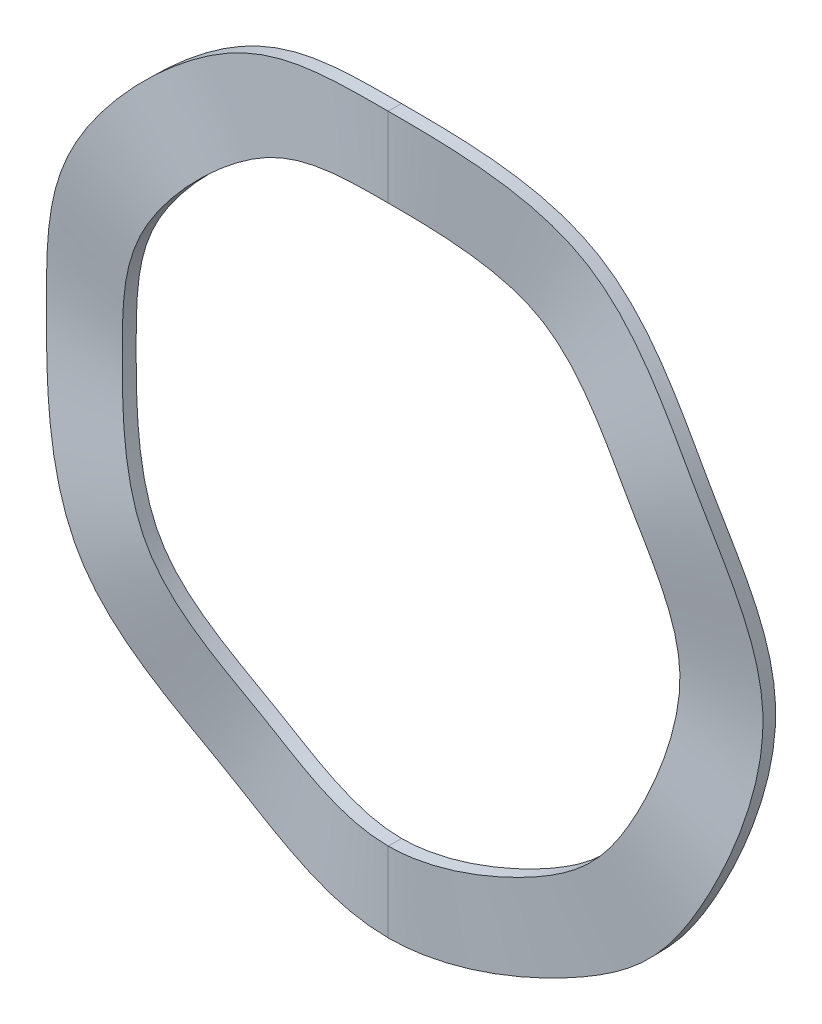
ISO-10303-21;
HEADER;
FILE_DESCRIPTION(('STEP AP214'),'2;1');
FILE_NAME('part.step','',(''),(''),'','','');
FILE_SCHEMA(('AUTOMOTIVE_DESIGN { 1 0 10303 214 1 1 1 1 }'));
ENDSEC;
DATA;
#1=APPLICATION_CONTEXT('core data for automotive mechanical design processes');
#2=APPLICATION_PROTOCOL_DEFINITION('international standard','automotive_design',2000,#1);
#3=PRODUCT_CONTEXT('',#1,'mechanical');
#4=PRODUCT('Part','Part','',(#3));
#5=PRODUCT_RELATED_PRODUCT_CATEGORY('part','',(#4));
#6=PRODUCT_DEFINITION_FORMATION('','',#4);
#7=PRODUCT_DEFINITION_CONTEXT('part definition',#1,'design');
#8=PRODUCT_DEFINITION('design','',#6,#7);
#9=PRODUCT_DEFINITION_SHAPE('','',#8);
#10=(LENGTH_UNIT() NAMED_UNIT(*) SI_UNIT(.MILLI.,.METRE.));
#11=(NAMED_UNIT(*) PLANE_ANGLE_UNIT() SI_UNIT($,.RADIAN.));
#12=(NAMED_UNIT(*) SI_UNIT($,.STERADIAN.) SOLID_ANGLE_UNIT());
#13=UNCERTAINTY_MEASURE_WITH_UNIT(LENGTH_MEASURE(1.E-05),#10,'distance_accuracy_value','');
#14=(GEOMETRIC_REPRESENTATION_CONTEXT(3) GLOBAL_UNCERTAINTY_ASSIGNED_CONTEXT((#13)) GLOBAL_UNIT_ASSIGNED_CONTEXT((#10,
#11,#12)) REPRESENTATION_CONTEXT('',''));
#15=CARTESIAN_POINT('',(0.,0.,0.));
#16=DIRECTION('',(0.,0.,1.));
#17=DIRECTION('',(1.,0.,0.));
#18=AXIS2_PLACEMENT_3D('',#15,#16,#17);
#19=CARTESIAN_POINT('',(0.,10.5,0.350000000000017));
#20=CARTESIAN_POINT('',(1.77728538317066,10.5000000018196,0.349999981886998));
#21=CARTESIAN_POINT('',(3.64871314918132,10.0076863447893,-0.13696586913417));
#22=CARTESIAN_POINT('',(6.84255403803462,8.1637214592486,-0.136966049851306));
#23=CARTESIAN_POINT('',(8.20466639914961,6.78915201465216,0.34974474595062));
#24=CARTESIAN_POINT('',(9.981911333171,3.71087353474015,0.349744529637985));
#25=CARTESIAN_POINT('',(10.4912811917421,1.84401258476812,-0.137222232479112));
#26=CARTESIAN_POINT('',(10.4912811897513,-1.84401258476917,-0.137222196130521));
#27=CARTESIAN_POINT('',(9.98191133160665,-3.71087353383022,0.349744547752384));
#28=CARTESIAN_POINT('',(8.20466640071307,-6.78915201556366,0.349744727836221));
#29=CARTESIAN_POINT('',(6.84255403853381,-8.16372146011046,-0.136966068026295));
#30=CARTESIAN_POINT('',(3.64871314868136,-10.0076863439278,-0.136965850959209));
#31=CARTESIAN_POINT('',(1.77727450652611,-10.5,0.349999999999962));
#32=CARTESIAN_POINT('',(0.,-10.5,0.35));
#33=CARTESIAN_POINT('',(0.,10.5,0.85));
#34=CARTESIAN_POINT('',(1.86545781878836,10.4999999981961,0.84999998188686));
#35=CARTESIAN_POINT('',(3.73278356534547,9.98519360415671,0.362525102079958));
#36=CARTESIAN_POINT('',(6.78103952717459,8.22528217387854,0.362524922987439));
#37=CARTESIAN_POINT('',(8.16054053163023,6.86547815698175,0.849744743344483));
#38=CARTESIAN_POINT('',(10.0259487401757,3.63449631970855,0.849744527027296));
#39=CARTESIAN_POINT('',(10.5137860726038,1.75994957860988,0.362271041086604));
#40=CARTESIAN_POINT('',(10.5137860778482,-1.75994957861096,0.362271077109233));
#41=CARTESIAN_POINT('',(10.0259487417489,-3.63449632060939,0.849744545142112));
#42=CARTESIAN_POINT('',(8.1605405300561,-6.86547815608253,0.84974472522964));
#43=CARTESIAN_POINT('',(6.78103952586401,-8.22528217160678,0.36252490497593));
#44=CARTESIAN_POINT('',(3.73278356665524,-9.98519360642895,0.362525120091439));
#45=CARTESIAN_POINT('',(1.86545990356562,-10.5,0.849999999999962));
#46=CARTESIAN_POINT('',(0.,-10.5,0.85));
#47=(BOUNDED_SURFACE() B_SPLINE_SURFACE(1,3,((#19,#20,#21,#22,#23,#24,#25,#26,#27,#28,#29,#30,
#31,#32),(#33,#34,#35,#36,#37,#38,#39,#40,#41,#42,#43,#44,#45,#46)),.UNSPECIFIED.,.F.,.F.,
.F.) B_SPLINE_SURFACE_WITH_KNOTS((2,2),(4,2,2,2,2,2,4),(0.,1.),(0.499999999999992,
0.583333333333328,0.66666666666667,0.75,0.833333333333335,0.916666666666669,1.),
.UNSPECIFIED.) GEOMETRIC_REPRESENTATION_ITEM() RATIONAL_B_SPLINE_SURFACE(((1.,1.,1.,1.,1.,1.,1.,
1.,1.,1.,1.,1.,1.,1.),(1.,1.,1.,1.,1.,1.,1.,1.,1.,1.,1.,1.,1.,1.))) REPRESENTATION_ITEM('') SURFACE());
#48=CARTESIAN_POINT('',(3.16306254910685E-13,10.5,0.350000000000017));
#49=CARTESIAN_POINT('',(2.702785568837E-13,10.5,0.85));
#50=(BOUNDED_CURVE() B_SPLINE_CURVE(1,(#48,#49),.UNSPECIFIED.,.F.,
.F.) B_SPLINE_CURVE_WITH_KNOTS((2,2),(0.,1.),
.UNSPECIFIED.) CURVE() GEOMETRIC_REPRESENTATION_ITEM() RATIONAL_B_SPLINE_CURVE((1.,1.)) REPRESENTATION_ITEM(''));
#51=CARTESIAN_POINT('',(3.16306254910685E-13,10.5,0.350000000000017));
#52=VERTEX_POINT('',#51);
#53=CARTESIAN_POINT('',(2.702785568837E-13,10.5,0.85));
#54=VERTEX_POINT('',#53);
#55=EDGE_CURVE('E109',#52,#54,#50,.T.);
#56=CARTESIAN_POINT('',(3.16306254910685E-13,10.5,0.350000000000017));
#57=CARTESIAN_POINT('',(1.77728538317091,10.5000000018195,0.349999981886935));
#58=CARTESIAN_POINT('',(3.64871314918137,10.0076863447892,-0.13696586913417));
#59=CARTESIAN_POINT('',(6.84255403803462,8.1637214592486,-0.136966049851306));
#60=CARTESIAN_POINT('',(8.20466639914961,6.78915201465216,0.34974474595062));
#61=CARTESIAN_POINT('',(9.981911333171,3.71087353474015,0.349744529637985));
#62=CARTESIAN_POINT('',(10.4912811917421,1.84401258476812,-0.137222232479112));
#63=CARTESIAN_POINT('',(10.4912811897513,-1.84401258476917,-0.137222196130521));
#64=CARTESIAN_POINT('',(9.98191133160665,-3.71087353383022,0.349744547752384));
#65=CARTESIAN_POINT('',(8.20466640071307,-6.78915201556366,0.349744727836221));
#66=CARTESIAN_POINT('',(6.84255403853381,-8.16372146011046,-0.136966068026295));
#67=CARTESIAN_POINT('',(3.64871314868136,-10.0076863439278,-0.136965850959209));
#68=CARTESIAN_POINT('',(1.77727450652611,-10.5,0.349999999999962));
#69=CARTESIAN_POINT('',(0.,-10.5,0.35));
#70=(BOUNDED_CURVE() B_SPLINE_CURVE(3,(#56,#57,#58,#59,#60,#61,#62,#63,#64,#65,#66,#67,#68,#69),
.UNSPECIFIED.,.F.,.F.) B_SPLINE_CURVE_WITH_KNOTS((4,2,2,2,2,2,4),(0.5,0.583333333333335,
0.666666666666676,0.75,0.833333333333338,0.916666666666671,1.),
.UNSPECIFIED.) CURVE() GEOMETRIC_REPRESENTATION_ITEM() RATIONAL_B_SPLINE_CURVE((1.,1.,1.,1.,1.,
1.,1.,1.,1.,1.,1.,1.,1.,1.)) REPRESENTATION_ITEM(''));
#71=CARTESIAN_POINT('',(0.,-10.5,0.35));
#72=VERTEX_POINT('',#71);
#73=EDGE_CURVE('E11',#52,#72,#70,.T.);
#74=CARTESIAN_POINT('',(0.,-10.5,0.35));
#75=CARTESIAN_POINT('',(0.,-10.5,0.85));
#76=(BOUNDED_CURVE() B_SPLINE_CURVE(1,(#74,#75),.UNSPECIFIED.,.F.,
.F.) B_SPLINE_CURVE_WITH_KNOTS((2,2),(0.,1.),
.UNSPECIFIED.) CURVE() GEOMETRIC_REPRESENTATION_ITEM() RATIONAL_B_SPLINE_CURVE((1.,1.)) REPRESENTATION_ITEM(''));
#77=CARTESIAN_POINT('',(0.,-10.5,0.85));
#78=VERTEX_POINT('',#77);
#79=EDGE_CURVE('E22',#72,#78,#76,.T.);
#80=CARTESIAN_POINT('',(2.702785568837E-13,10.5,0.85));
#81=CARTESIAN_POINT('',(1.86545781878849,10.4999999981961,0.849999981886825));
#82=CARTESIAN_POINT('',(3.73278356534547,9.98519360415671,0.362525102079958));
#83=CARTESIAN_POINT('',(6.78103952717459,8.22528217387854,0.362524922987439));
#84=CARTESIAN_POINT('',(8.16054053163023,6.86547815698175,0.849744743344483));
#85=CARTESIAN_POINT('',(10.0259487401757,3.63449631970855,0.849744527027296));
#86=CARTESIAN_POINT('',(10.5137860726038,1.75994957860988,0.362271041086604));
#87=CARTESIAN_POINT('',(10.5137860778482,-1.75994957861096,0.362271077109233));
#88=CARTESIAN_POINT('',(10.0259487417489,-3.63449632060939,0.849744545142112));
#89=CARTESIAN_POINT('',(8.1605405300561,-6.86547815608253,0.84974472522964));
#90=CARTESIAN_POINT('',(6.78103952586401,-8.22528217160678,0.36252490497593));
#91=CARTESIAN_POINT('',(3.73278356665524,-9.98519360642895,0.362525120091439));
#92=CARTESIAN_POINT('',(1.86545990356562,-10.5,0.849999999999962));
#93=CARTESIAN_POINT('',(0.,-10.5,0.85));
#94=(BOUNDED_CURVE() B_SPLINE_CURVE(3,(#80,#81,#82,#83,#84,#85,#86,#87,#88,#89,#90,#91,#92,#93),
.UNSPECIFIED.,.F.,.F.) B_SPLINE_CURVE_WITH_KNOTS((4,2,2,2,2,2,4),(0.5,0.583333333333333,
0.666666666666674,0.75,0.833333333333338,0.91666666666667,1.),
.UNSPECIFIED.) CURVE() GEOMETRIC_REPRESENTATION_ITEM() RATIONAL_B_SPLINE_CURVE((1.,1.,1.,1.,1.,
1.,1.,1.,1.,1.,1.,1.,1.,1.)) REPRESENTATION_ITEM(''));
#95=EDGE_CURVE('E78',#54,#78,#94,.T.);
#96=ORIENTED_EDGE('',*,*,#55,.F.);
#97=ORIENTED_EDGE('',*,*,#73,.T.);
#98=ORIENTED_EDGE('',*,*,#79,.T.);
#99=ORIENTED_EDGE('',*,*,#95,.F.);
#100=EDGE_LOOP('',(#96,#97,#98,#99));
#101=FACE_BOUND('',#100,.T.);
#102=ADVANCED_FACE('F16',(#101),#47,.F.);
#103=CARTESIAN_POINT('',(0.,13.5,0.350000000000017));
#104=CARTESIAN_POINT('',(2.31317849028773,13.5000000018176,0.350000003621701));
#105=CARTESIAN_POINT('',(4.66289318457483,12.8827241886085,-0.272301408902137));
#106=CARTESIAN_POINT('',(8.82531983479983,10.4795460642598,-0.272301373732492));
#107=CARTESIAN_POINT('',(10.5347690255751,8.75329584755968,0.350051052374429));
#108=CARTESIAN_POINT('',(12.8479611023448,4.74672968618188,0.35005109563796));
#109=CARTESIAN_POINT('',(13.4882408331361,2.40317431503527,-0.272251517642486));
#110=CARTESIAN_POINT('',(13.48824082919,-2.40317431503662,-0.272251524718881));
#111=CARTESIAN_POINT('',(12.8479611007803,-4.74672968527711,0.350051092016329));
#112=CARTESIAN_POINT('',(10.5347690271384,-8.75329584846648,0.350051055996059));
#113=CARTESIAN_POINT('',(8.82531983578968,-10.4795460659696,-0.272301370194933));
#114=CARTESIAN_POINT('',(4.66289318358393,-12.8827241868993,-0.272301412439696));
#115=CARTESIAN_POINT('',(2.31317289138833,-13.5,0.349999999999933));
#116=CARTESIAN_POINT('',(0.,-13.5,0.35));
#117=CARTESIAN_POINT('',(0.,10.5,0.350000000000017));
#118=CARTESIAN_POINT('',(1.7772853831707,10.5000000018196,0.349999981886988));
#119=CARTESIAN_POINT('',(3.64871314918136,10.0076863447892,-0.13696586913417));
#120=CARTESIAN_POINT('',(6.84255403803462,8.1637214592486,-0.136966049851306));
#121=CARTESIAN_POINT('',(8.20466639914961,6.78915201465216,0.34974474595062));
#122=CARTESIAN_POINT('',(9.981911333171,3.71087353474015,0.349744529637985));
#123=CARTESIAN_POINT('',(10.4912811917421,1.84401258476812,-0.137222232479112));
#124=CARTESIAN_POINT('',(10.4912811897513,-1.84401258476917,-0.137222196130521));
#125=CARTESIAN_POINT('',(9.98191133160665,-3.71087353383022,0.349744547752384));
#126=CARTESIAN_POINT('',(8.20466640071307,-6.78915201556366,0.349744727836221));
#127=CARTESIAN_POINT('',(6.84255403853381,-8.16372146011046,-0.136966068026295));
#128=CARTESIAN_POINT('',(3.64871314868136,-10.0076863439278,-0.136965850959209));
#129=CARTESIAN_POINT('',(1.77727450652611,-10.5,0.349999999999962));
#130=CARTESIAN_POINT('',(0.,-10.5,0.35));
#131=(BOUNDED_SURFACE() B_SPLINE_SURFACE(1,3,((#103,#104,#105,#106,#107,#108,#109,#110,#111,
#112,#113,#114,#115,#116),(#117,#118,#119,#120,#121,#122,#123,#124,#125,#126,#127,#128,#129,
#130)),.UNSPECIFIED.,.F.,.F.,.F.) B_SPLINE_SURFACE_WITH_KNOTS((2,2),(4,2,2,2,2,2,4),(0.,1.),
(0.499999999999992,0.583333333333328,0.66666666666667,0.75,0.833333333333335,0.916666666666669,
1.),.UNSPECIFIED.) GEOMETRIC_REPRESENTATION_ITEM() RATIONAL_B_SPLINE_SURFACE(((1.,1.,1.,1.,1.,
1.,1.,1.,1.,1.,1.,1.,1.,1.),(1.,1.,1.,1.,1.,1.,1.,1.,1.,1.,1.,1.,1.,1.))) REPRESENTATION_ITEM('') SURFACE());
#132=CARTESIAN_POINT('',(3.56467411762523E-13,13.5,0.350000000000017));
#133=CARTESIAN_POINT('',(3.16306254910685E-13,10.5,0.350000000000017));
#134=(BOUNDED_CURVE() B_SPLINE_CURVE(1,(#132,#133),.UNSPECIFIED.,.F.,
.F.) B_SPLINE_CURVE_WITH_KNOTS((2,2),(0.,1.),
.UNSPECIFIED.) CURVE() GEOMETRIC_REPRESENTATION_ITEM() RATIONAL_B_SPLINE_CURVE((1.,1.)) REPRESENTATION_ITEM(''));
#135=CARTESIAN_POINT('',(3.56467411762523E-13,13.5,0.350000000000017));
#136=VERTEX_POINT('',#135);
#137=EDGE_CURVE('E94',#136,#52,#134,.T.);
#138=CARTESIAN_POINT('',(3.56467411762523E-13,13.5,0.350000000000017));
#139=CARTESIAN_POINT('',(2.31317849028795,13.5000000018175,0.350000003621642));
#140=CARTESIAN_POINT('',(4.66289318457483,12.8827241886085,-0.272301408902137));
#141=CARTESIAN_POINT('',(8.82531983479983,10.4795460642598,-0.272301373732492));
#142=CARTESIAN_POINT('',(10.5347690255751,8.75329584755968,0.350051052374429));
#143=CARTESIAN_POINT('',(12.8479611023448,4.74672968618188,0.35005109563796));
#144=CARTESIAN_POINT('',(13.4882408331361,2.40317431503527,-0.272251517642486));
#145=CARTESIAN_POINT('',(13.48824082919,-2.40317431503662,-0.272251524718881));
#146=CARTESIAN_POINT('',(12.8479611007803,-4.74672968527711,0.350051092016329));
#147=CARTESIAN_POINT('',(10.5347690271384,-8.75329584846648,0.350051055996059));
#148=CARTESIAN_POINT('',(8.82531983578968,-10.4795460659696,-0.272301370194933));
#149=CARTESIAN_POINT('',(4.66289318358393,-12.8827241868993,-0.272301412439696));
#150=CARTESIAN_POINT('',(2.31317289138833,-13.5,0.349999999999933));
#151=CARTESIAN_POINT('',(0.,-13.5,0.35));
#152=(BOUNDED_CURVE() B_SPLINE_CURVE(3,(#138,#139,#140,#141,#142,#143,#144,#145,#146,#147,#148,
#149,#150,#151),.UNSPECIFIED.,.F.,.F.) B_SPLINE_CURVE_WITH_KNOTS((4,2,2,2,2,2,4),(0.5,
0.583333333333335,0.666666666666676,0.75,0.833333333333338,0.916666666666671,1.),
.UNSPECIFIED.) CURVE() GEOMETRIC_REPRESENTATION_ITEM() RATIONAL_B_SPLINE_CURVE((1.,1.,1.,1.,1.,
1.,1.,1.,1.,1.,1.,1.,1.,1.)) REPRESENTATION_ITEM(''));
#153=CARTESIAN_POINT('',(0.,-13.5,0.35));
#154=VERTEX_POINT('',#153);
#155=EDGE_CURVE('E31',#136,#154,#152,.T.);
#156=CARTESIAN_POINT('',(0.,-13.5,0.35));
#157=CARTESIAN_POINT('',(0.,-10.5,0.35));
#158=(BOUNDED_CURVE() B_SPLINE_CURVE(1,(#156,#157),.UNSPECIFIED.,.F.,
.F.) B_SPLINE_CURVE_WITH_KNOTS((2,2),(0.,1.),
.UNSPECIFIED.) CURVE() GEOMETRIC_REPRESENTATION_ITEM() RATIONAL_B_SPLINE_CURVE((1.,1.)) REPRESENTATION_ITEM(''));
#159=EDGE_CURVE('E97',#154,#72,#158,.T.);
#160=ORIENTED_EDGE('',*,*,#137,.F.);
#161=ORIENTED_EDGE('',*,*,#155,.T.);
#162=ORIENTED_EDGE('',*,*,#159,.T.);
#163=ORIENTED_EDGE('',*,*,#73,.F.);
#164=EDGE_LOOP('',(#160,#161,#162,#163));
#165=FACE_BOUND('',#164,.T.);
#166=ADVANCED_FACE('F93',(#165),#131,.F.);
#167=CARTESIAN_POINT('',(0.,13.5,0.85));
#168=CARTESIAN_POINT('',(2.40135092590542,13.4999999981941,0.850000003621562));
#169=CARTESIAN_POINT('',(4.74696360073898,12.8602314479759,0.227189562311881));
#170=CARTESIAN_POINT('',(8.7638053239398,10.5411067788897,0.227189599106364));
#171=CARTESIAN_POINT('',(10.4906431580557,8.82962198988927,0.850051049768291));
#172=CARTESIAN_POINT('',(12.8919985093494,4.67035247115027,0.850051093027243));
#173=CARTESIAN_POINT('',(13.5107457139979,2.31911130887703,0.22724175592323));
#174=CARTESIAN_POINT('',(13.5107457172869,-2.3191113088784,0.227241748520874));
#175=CARTESIAN_POINT('',(12.8919985109225,-4.67035247205628,0.85005108940614));
#176=CARTESIAN_POINT('',(10.4906431564815,-8.82962198898535,0.850051053389422));
#177=CARTESIAN_POINT('',(8.76380532311987,-10.5411067774659,0.227189602807376));
#178=CARTESIAN_POINT('',(4.7469636015578,-12.8602314494004,0.227189558610869));
#179=CARTESIAN_POINT('',(2.40135828842785,-13.5,0.849999999999934));
#180=CARTESIAN_POINT('',(0.,-13.5,0.85));
#181=CARTESIAN_POINT('',(0.,13.5,0.350000000000017));
#182=CARTESIAN_POINT('',(2.31317849028773,13.5000000018176,0.3500000036217));
#183=CARTESIAN_POINT('',(4.66289318457483,12.8827241886085,-0.272301408902137));
#184=CARTESIAN_POINT('',(8.82531983479983,10.4795460642598,-0.272301373732492));
#185=CARTESIAN_POINT('',(10.5347690255751,8.75329584755968,0.350051052374429));
#186=CARTESIAN_POINT('',(12.8479611023448,4.74672968618188,0.35005109563796));
#187=CARTESIAN_POINT('',(13.4882408331361,2.40317431503527,-0.272251517642486));
#188=CARTESIAN_POINT('',(13.48824082919,-2.40317431503662,-0.272251524718881));
#189=CARTESIAN_POINT('',(12.8479611007803,-4.74672968527711,0.350051092016329));
#190=CARTESIAN_POINT('',(10.5347690271384,-8.75329584846648,0.350051055996059));
#191=CARTESIAN_POINT('',(8.82531983578968,-10.4795460659696,-0.272301370194933));
#192=CARTESIAN_POINT('',(4.66289318358393,-12.8827241868993,-0.272301412439696));
#193=CARTESIAN_POINT('',(2.31317289138833,-13.5,0.349999999999933));
#194=CARTESIAN_POINT('',(0.,-13.5,0.35));
#195=(BOUNDED_SURFACE() B_SPLINE_SURFACE(1,3,((#167,#168,#169,#170,#171,#172,#173,#174,#175,
#176,#177,#178,#179,#180),(#181,#182,#183,#184,#185,#186,#187,#188,#189,#190,#191,#192,#193,
#194)),.UNSPECIFIED.,.F.,.F.,.F.) B_SPLINE_SURFACE_WITH_KNOTS((2,2),(4,2,2,2,2,2,4),(0.,1.),
(0.499999999999992,0.583333333333328,0.66666666666667,0.75,0.833333333333335,0.916666666666669,
1.),.UNSPECIFIED.) GEOMETRIC_REPRESENTATION_ITEM() RATIONAL_B_SPLINE_SURFACE(((1.,1.,1.,1.,1.,
1.,1.,1.,1.,1.,1.,1.,1.,1.),(1.,1.,1.,1.,1.,1.,1.,1.,1.,1.,1.,1.,1.,1.))) REPRESENTATION_ITEM('') SURFACE());
#196=CARTESIAN_POINT('',(3.92546219599937E-13,13.5,0.85));
#197=CARTESIAN_POINT('',(3.56467411762523E-13,13.5,0.350000000000017));
#198=(BOUNDED_CURVE() B_SPLINE_CURVE(1,(#196,#197),.UNSPECIFIED.,.F.,
.F.) B_SPLINE_CURVE_WITH_KNOTS((2,2),(0.,1.),
.UNSPECIFIED.) CURVE() GEOMETRIC_REPRESENTATION_ITEM() RATIONAL_B_SPLINE_CURVE((1.,1.)) REPRESENTATION_ITEM(''));
#199=CARTESIAN_POINT('',(3.92546219599937E-13,13.5,0.85));
#200=VERTEX_POINT('',#199);
#201=EDGE_CURVE('E128',#200,#136,#198,.T.);
#202=CARTESIAN_POINT('',(3.92546219599937E-13,13.5,0.85));
#203=CARTESIAN_POINT('',(2.40135092590564,13.4999999981941,0.850000003621504));
#204=CARTESIAN_POINT('',(4.74696360073898,12.8602314479759,0.227189562311881));
#205=CARTESIAN_POINT('',(8.7638053239398,10.5411067788897,0.227189599106364));
#206=CARTESIAN_POINT('',(10.4906431580557,8.82962198988927,0.850051049768291));
#207=CARTESIAN_POINT('',(12.8919985093494,4.67035247115027,0.850051093027243));
#208=CARTESIAN_POINT('',(13.5107457139979,2.31911130887703,0.22724175592323));
#209=CARTESIAN_POINT('',(13.5107457172869,-2.3191113088784,0.227241748520874));
#210=CARTESIAN_POINT('',(12.8919985109225,-4.67035247205628,0.85005108940614));
#211=CARTESIAN_POINT('',(10.4906431564815,-8.82962198898535,0.850051053389422));
#212=CARTESIAN_POINT('',(8.76380532311987,-10.5411067774659,0.227189602807376));
#213=CARTESIAN_POINT('',(4.7469636015578,-12.8602314494004,0.227189558610869));
#214=CARTESIAN_POINT('',(2.40135828842785,-13.5,0.849999999999934));
#215=CARTESIAN_POINT('',(0.,-13.5,0.85));
#216=(BOUNDED_CURVE() B_SPLINE_CURVE(3,(#202,#203,#204,#205,#206,#207,#208,#209,#210,#211,#212,
#213,#214,#215),.UNSPECIFIED.,.F.,.F.) B_SPLINE_CURVE_WITH_KNOTS((4,2,2,2,2,2,4),(0.5,
0.583333333333335,0.666666666666676,0.75,0.833333333333338,0.916666666666671,1.),
.UNSPECIFIED.) CURVE() GEOMETRIC_REPRESENTATION_ITEM() RATIONAL_B_SPLINE_CURVE((1.,1.,1.,1.,1.,
1.,1.,1.,1.,1.,1.,1.,1.,1.)) REPRESENTATION_ITEM(''));
#217=CARTESIAN_POINT('',(0.,-13.5,0.85));
#218=VERTEX_POINT('',#217);
#219=EDGE_CURVE('E46',#200,#218,#216,.T.);
#220=CARTESIAN_POINT('',(0.,-13.5,0.85));
#221=CARTESIAN_POINT('',(0.,-13.5,0.35));
#222=(BOUNDED_CURVE() B_SPLINE_CURVE(1,(#220,#221),.UNSPECIFIED.,.F.,
.F.) B_SPLINE_CURVE_WITH_KNOTS((2,2),(0.,1.),
.UNSPECIFIED.) CURVE() GEOMETRIC_REPRESENTATION_ITEM() RATIONAL_B_SPLINE_CURVE((1.,1.)) REPRESENTATION_ITEM(''));
#223=EDGE_CURVE('E135',#218,#154,#222,.T.);
#224=ORIENTED_EDGE('',*,*,#201,.F.);
#225=ORIENTED_EDGE('',*,*,#219,.T.);
#226=ORIENTED_EDGE('',*,*,#223,.T.);
#227=ORIENTED_EDGE('',*,*,#155,.F.);
#228=EDGE_LOOP('',(#224,#225,#226,#227));
#229=FACE_BOUND('',#228,.T.);
#230=ADVANCED_FACE('F205',(#229),#195,.F.);
#231=CARTESIAN_POINT('',(0.,10.5,0.85));
#232=CARTESIAN_POINT('',(1.86545781878836,10.4999999981961,0.84999998188686));
#233=CARTESIAN_POINT('',(3.73278356534547,9.98519360415671,0.362525102079958));
#234=CARTESIAN_POINT('',(6.78103952717459,8.22528217387854,0.362524922987439));
#235=CARTESIAN_POINT('',(8.16054053163023,6.86547815698175,0.849744743344483));
#236=CARTESIAN_POINT('',(10.0259487401757,3.63449631970855,0.849744527027296));
#237=CARTESIAN_POINT('',(10.5137860726038,1.75994957860988,0.362271041086604));
#238=CARTESIAN_POINT('',(10.5137860778482,-1.75994957861096,0.362271077109233));
#239=CARTESIAN_POINT('',(10.0259487417489,-3.63449632060939,0.849744545142112));
#240=CARTESIAN_POINT('',(8.1605405300561,-6.86547815608253,0.84974472522964));
#241=CARTESIAN_POINT('',(6.78103952586401,-8.22528217160678,0.36252490497593));
#242=CARTESIAN_POINT('',(3.73278356665524,-9.98519360642895,0.362525120091439));
#243=CARTESIAN_POINT('',(1.86545990356562,-10.5,0.849999999999962));
#244=CARTESIAN_POINT('',(0.,-10.5,0.85));
#245=CARTESIAN_POINT('',(-1.08203376814053E-13,13.5,0.85));
#246=CARTESIAN_POINT('',(2.40135092590537,13.4999999981941,0.850000003621575));
#247=CARTESIAN_POINT('',(4.74696360073893,12.860231447976,0.227189562311881));
#248=CARTESIAN_POINT('',(8.7638053239398,10.5411067788897,0.227189599106364));
#249=CARTESIAN_POINT('',(10.4906431580557,8.82962198988927,0.850051049768291));
#250=CARTESIAN_POINT('',(12.8919985093494,4.67035247115027,0.850051093027243));
#251=CARTESIAN_POINT('',(13.5107457139979,2.31911130887703,0.22724175592323));
#252=CARTESIAN_POINT('',(13.5107457172869,-2.3191113088784,0.227241748520874));
#253=CARTESIAN_POINT('',(12.8919985109225,-4.67035247205628,0.85005108940614));
#254=CARTESIAN_POINT('',(10.4906431564815,-8.82962198898535,0.850051053389422));
#255=CARTESIAN_POINT('',(8.76380532311987,-10.5411067774659,0.227189602807376));
#256=CARTESIAN_POINT('',(4.7469636015578,-12.8602314494004,0.227189558610869));
#257=CARTESIAN_POINT('',(2.40135828842785,-13.5,0.849999999999934));
#258=CARTESIAN_POINT('',(0.,-13.5,0.85));
#259=(BOUNDED_SURFACE() B_SPLINE_SURFACE(1,3,((#231,#232,#233,#234,#235,#236,#237,#238,#239,
#240,#241,#242,#243,#244),(#245,#246,#247,#248,#249,#250,#251,#252,#253,#254,#255,#256,#257,
#258)),.UNSPECIFIED.,.F.,.F.,.F.) B_SPLINE_SURFACE_WITH_KNOTS((2,2),(4,2,2,2,2,2,4),(0.,1.),
(0.499999999999992,0.583333333333328,0.66666666666667,0.75,0.833333333333335,0.916666666666669,
1.),.UNSPECIFIED.) GEOMETRIC_REPRESENTATION_ITEM() RATIONAL_B_SPLINE_SURFACE(((1.,1.,1.,1.,1.,
1.,1.,1.,1.,1.,1.,1.,1.,1.),(1.,1.,1.,1.,1.,1.,1.,1.,1.,1.,1.,1.,1.,1.))) REPRESENTATION_ITEM('') SURFACE());
#260=CARTESIAN_POINT('',(2.702785568837E-13,10.5,0.85));
#261=CARTESIAN_POINT('',(3.92546219599937E-13,13.5,0.85));
#262=(BOUNDED_CURVE() B_SPLINE_CURVE(1,(#260,#261),.UNSPECIFIED.,.F.,
.F.) B_SPLINE_CURVE_WITH_KNOTS((2,2),(0.,1.),
.UNSPECIFIED.) CURVE() GEOMETRIC_REPRESENTATION_ITEM() RATIONAL_B_SPLINE_CURVE((1.,1.)) REPRESENTATION_ITEM(''));
#263=EDGE_CURVE('E170',#54,#200,#262,.T.);
#264=CARTESIAN_POINT('',(0.,-10.5,0.85));
#265=CARTESIAN_POINT('',(0.,-13.5,0.85));
#266=(BOUNDED_CURVE() B_SPLINE_CURVE(1,(#264,#265),.UNSPECIFIED.,.F.,
.F.) B_SPLINE_CURVE_WITH_KNOTS((2,2),(0.,1.),
.UNSPECIFIED.) CURVE() GEOMETRIC_REPRESENTATION_ITEM() RATIONAL_B_SPLINE_CURVE((1.,1.)) REPRESENTATION_ITEM(''));
#267=EDGE_CURVE('E143',#78,#218,#266,.T.);
#268=ORIENTED_EDGE('',*,*,#263,.F.);
#269=ORIENTED_EDGE('',*,*,#95,.T.);
#270=ORIENTED_EDGE('',*,*,#267,.T.);
#271=ORIENTED_EDGE('',*,*,#219,.F.);
#272=EDGE_LOOP('',(#268,#269,#270,#271));
#273=FACE_BOUND('',#272,.T.);
#274=ADVANCED_FACE('F234',(#273),#259,.F.);
#275=CARTESIAN_POINT('',(0.,-10.5,0.85));
#276=CARTESIAN_POINT('',(-1.86545990356569,-10.5,0.850000000000045));
#277=CARTESIAN_POINT('',(-3.73278356534071,-9.98519360415666,0.362525102081069));
#278=CARTESIAN_POINT('',(-6.78103952717959,-8.22528217387845,0.362524922986329));
#279=CARTESIAN_POINT('',(-8.16054053162595,-6.86547815698623,0.849744743342873));
#280=CARTESIAN_POINT('',(-10.0259487401797,-3.63449631970448,0.849744527028878));
#281=CARTESIAN_POINT('',(-10.5137860725999,-1.75994957861137,0.362271041087104));
#282=CARTESIAN_POINT('',(-10.5137860778521,1.75994957861165,0.362271077108734));
#283=CARTESIAN_POINT('',(-10.0259487417375,3.63449632061161,0.849744545139669));
#284=CARTESIAN_POINT('',(-8.1605405300678,6.86547815607969,0.84974472523211));
#285=CARTESIAN_POINT('',(-6.78103952586427,8.22528217160855,0.362524904974515));
#286=CARTESIAN_POINT('',(-3.73278356665536,9.98519360642695,0.362525120092855));
#287=CARTESIAN_POINT('',(-1.86545781878832,10.5000000018039,0.850000018113157));
#288=CARTESIAN_POINT('',(0.,10.5,0.85));
#289=CARTESIAN_POINT('',(0.,-13.5,0.85));
#290=CARTESIAN_POINT('',(-2.40135828842794,-13.5,0.850000000000073));
#291=CARTESIAN_POINT('',(-4.7469636007399,-12.8602314479732,0.227189562312296));
#292=CARTESIAN_POINT('',(-8.76380532393914,-10.5411067788923,0.227189599105948));
#293=CARTESIAN_POINT('',(-10.4906431580522,-8.82962198989097,0.85005104976657));
#294=CARTESIAN_POINT('',(-12.8919985093527,-4.67035247114911,0.850051093028964));
#295=CARTESIAN_POINT('',(-13.5107457139939,-2.31911130888308,0.227241755924313));
#296=CARTESIAN_POINT('',(-13.5107457172908,2.31911130888345,0.227241748519791));
#297=CARTESIAN_POINT('',(-12.8919985109144,4.67035247205632,0.850051089405501));
#298=CARTESIAN_POINT('',(-10.49064315649,8.82962198898452,0.850051053390033));
#299=CARTESIAN_POINT('',(-8.76380532311848,10.5411067774683,0.227189602805322));
#300=CARTESIAN_POINT('',(-4.7469636015597,12.8602314493977,0.227189558612894));
#301=CARTESIAN_POINT('',(-2.40135092590534,13.5000000018059,0.849999996378445));
#302=CARTESIAN_POINT('',(0.,13.5,0.85));
#303=(BOUNDED_SURFACE() B_SPLINE_SURFACE(1,3,((#275,#276,#277,#278,#279,#280,#281,#282,#283,
#284,#285,#286,#287,#288),(#289,#290,#291,#292,#293,#294,#295,#296,#297,#298,#299,#300,#301,
#302)),.UNSPECIFIED.,.F.,.F.,.F.) B_SPLINE_SURFACE_WITH_KNOTS((2,2),(4,2,2,2,2,2,4),(0.,1.),(0.,
0.0833333333333341,0.166666666666665,0.25,0.33333333333333,0.416666666666664,0.499999999999992),
.UNSPECIFIED.) GEOMETRIC_REPRESENTATION_ITEM() RATIONAL_B_SPLINE_SURFACE(((1.,1.,1.,1.,1.,1.,1.,
1.,1.,1.,1.,1.,1.,1.),(1.,1.,1.,1.,1.,1.,1.,1.,1.,1.,1.,1.,1.,1.))) REPRESENTATION_ITEM('') SURFACE());
#304=CARTESIAN_POINT('',(0.,-10.5,0.85));
#305=CARTESIAN_POINT('',(-1.86545990356569,-10.5,0.850000000000045));
#306=CARTESIAN_POINT('',(-3.73278356534071,-9.98519360415666,0.362525102081069));
#307=CARTESIAN_POINT('',(-6.78103952717959,-8.22528217387845,0.362524922986329));
#308=CARTESIAN_POINT('',(-8.16054053162595,-6.86547815698623,0.849744743342873));
#309=CARTESIAN_POINT('',(-10.0259487401797,-3.63449631970448,0.849744527028878));
#310=CARTESIAN_POINT('',(-10.5137860725999,-1.75994957861137,0.362271041087104));
#311=CARTESIAN_POINT('',(-10.5137860778521,1.75994957861165,0.362271077108734));
#312=CARTESIAN_POINT('',(-10.0259487417375,3.63449632061161,0.849744545139669));
#313=CARTESIAN_POINT('',(-8.1605405300678,6.86547815607969,0.84974472523211));
#314=CARTESIAN_POINT('',(-6.78103952586427,8.22528217160855,0.362524904974515));
#315=CARTESIAN_POINT('',(-3.7327835666554,9.98519360642693,0.362525120092855));
#316=CARTESIAN_POINT('',(-1.86545781878822,10.5000000018039,0.850000018113183));
#317=CARTESIAN_POINT('',(2.702785568837E-13,10.5,0.85));
#318=(BOUNDED_CURVE() B_SPLINE_CURVE(3,(#304,#305,#306,#307,#308,#309,#310,#311,#312,#313,#314,
#315,#316,#317),.UNSPECIFIED.,.F.,.F.) B_SPLINE_CURVE_WITH_KNOTS((4,2,2,2,2,2,4),(0.,
0.0833333333333351,0.166666666666667,0.25,0.333333333333334,0.416666666666669,0.5),
.UNSPECIFIED.) CURVE() GEOMETRIC_REPRESENTATION_ITEM() RATIONAL_B_SPLINE_CURVE((1.,1.,1.,1.,1.,
1.,1.,1.,1.,1.,1.,1.,1.,1.)) REPRESENTATION_ITEM(''));
#319=EDGE_CURVE('E113',#78,#54,#318,.T.);
#320=CARTESIAN_POINT('',(0.,-13.5,0.85));
#321=CARTESIAN_POINT('',(-2.40135828842794,-13.5,0.850000000000073));
#322=CARTESIAN_POINT('',(-4.7469636007399,-12.8602314479732,0.227189562312296));
#323=CARTESIAN_POINT('',(-8.76380532393914,-10.5411067788923,0.227189599105948));
#324=CARTESIAN_POINT('',(-10.4906431580522,-8.82962198989097,0.85005104976657));
#325=CARTESIAN_POINT('',(-12.8919985093527,-4.67035247114911,0.850051093028964));
#326=CARTESIAN_POINT('',(-13.5107457139939,-2.31911130888308,0.227241755924313));
#327=CARTESIAN_POINT('',(-13.5107457172908,2.31911130888345,0.227241748519791));
#328=CARTESIAN_POINT('',(-12.8919985109144,4.67035247205632,0.850051089405501));
#329=CARTESIAN_POINT('',(-10.49064315649,8.82962198898452,0.850051053390033));
#330=CARTESIAN_POINT('',(-8.76380532311848,10.5411067774683,0.227189602805322));
#331=CARTESIAN_POINT('',(-4.74696360155971,12.8602314493977,0.227189558612894));
#332=CARTESIAN_POINT('',(-2.40135092590512,13.500000001806,0.849999996378504));
#333=CARTESIAN_POINT('',(3.92546219599937E-13,13.5,0.85));
#334=(BOUNDED_CURVE() B_SPLINE_CURVE(3,(#320,#321,#322,#323,#324,#325,#326,#327,#328,#329,#330,
#331,#332,#333),.UNSPECIFIED.,.F.,.F.) B_SPLINE_CURVE_WITH_KNOTS((4,2,2,2,2,2,4),(0.,
0.0833333333333353,0.166666666666668,0.25,0.333333333333335,0.41666666666667,0.5),
.UNSPECIFIED.) CURVE() GEOMETRIC_REPRESENTATION_ITEM() RATIONAL_B_SPLINE_CURVE((1.,1.,1.,1.,1.,
1.,1.,1.,1.,1.,1.,1.,1.,1.)) REPRESENTATION_ITEM(''));
#335=EDGE_CURVE('E125',#218,#200,#334,.T.);
#336=ORIENTED_EDGE('',*,*,#319,.T.);
#337=ORIENTED_EDGE('',*,*,#263,.T.);
#338=ORIENTED_EDGE('',*,*,#335,.F.);
#339=ORIENTED_EDGE('',*,*,#267,.F.);
#340=EDGE_LOOP('',(#336,#337,#338,#339));
#341=FACE_BOUND('',#340,.T.);
#342=ADVANCED_FACE('F233',(#341),#303,.F.);
#343=CARTESIAN_POINT('',(0.,-13.5,0.85));
#344=CARTESIAN_POINT('',(-2.40135828842794,-13.5,0.850000000000073));
#345=CARTESIAN_POINT('',(-4.7469636007399,-12.8602314479732,0.227189562312296));
#346=CARTESIAN_POINT('',(-8.76380532393914,-10.5411067788923,0.227189599105948));
#347=CARTESIAN_POINT('',(-10.4906431580522,-8.82962198989097,0.85005104976657));
#348=CARTESIAN_POINT('',(-12.8919985093527,-4.67035247114911,0.850051093028964));
#349=CARTESIAN_POINT('',(-13.5107457139939,-2.31911130888308,0.227241755924313));
#350=CARTESIAN_POINT('',(-13.5107457172908,2.31911130888345,0.227241748519791));
#351=CARTESIAN_POINT('',(-12.8919985109144,4.67035247205632,0.850051089405501));
#352=CARTESIAN_POINT('',(-10.49064315649,8.82962198898452,0.850051053390033));
#353=CARTESIAN_POINT('',(-8.76380532311848,10.5411067774683,0.227189602805322));
#354=CARTESIAN_POINT('',(-4.7469636015597,12.8602314493977,0.227189558612894));
#355=CARTESIAN_POINT('',(-2.40135092590534,13.5000000018059,0.849999996378445));
#356=CARTESIAN_POINT('',(0.,13.5,0.85));
#357=CARTESIAN_POINT('',(0.,-13.5,0.35));
#358=CARTESIAN_POINT('',(-2.31317289138843,-13.5,0.350000000000072));
#359=CARTESIAN_POINT('',(-4.66289318457445,-12.882724188606,-0.272301408901749));
#360=CARTESIAN_POINT('',(-8.82531983480047,-10.4795460642622,-0.27230137373288));
#361=CARTESIAN_POINT('',(-10.5347690255698,-8.75329584756202,0.350051052372541));
#362=CARTESIAN_POINT('',(-12.8479611023498,-4.74672968618007,0.350051095639847));
#363=CARTESIAN_POINT('',(-13.4882408331322,-2.40317431504148,-0.272251517641625));
#364=CARTESIAN_POINT('',(-13.488240829194,2.40317431504181,-0.272251524719741));
#365=CARTESIAN_POINT('',(-12.8479611007759,4.74672968527651,0.35005109201583));
#366=CARTESIAN_POINT('',(-10.5347690271433,8.75329584846629,0.350051055996531));
#367=CARTESIAN_POINT('',(-8.82531983578861,10.4795460659718,-0.272301370196654));
#368=CARTESIAN_POINT('',(-4.66289318358549,12.8827241868968,-0.272301412437976));
#369=CARTESIAN_POINT('',(-2.31317849028768,13.4999999981824,0.349999996378334));
#370=CARTESIAN_POINT('',(0.,13.5,0.350000000000017));
#371=(BOUNDED_SURFACE() B_SPLINE_SURFACE(1,3,((#343,#344,#345,#346,#347,#348,#349,#350,#351,
#352,#353,#354,#355,#356),(#357,#358,#359,#360,#361,#362,#363,#364,#365,#366,#367,#368,#369,
#370)),.UNSPECIFIED.,.F.,.F.,.F.) B_SPLINE_SURFACE_WITH_KNOTS((2,2),(4,2,2,2,2,2,4),(0.,1.),(0.,
0.0833333333333341,0.166666666666665,0.25,0.33333333333333,0.416666666666664,0.499999999999992),
.UNSPECIFIED.) GEOMETRIC_REPRESENTATION_ITEM() RATIONAL_B_SPLINE_SURFACE(((1.,1.,1.,1.,1.,1.,1.,
1.,1.,1.,1.,1.,1.,1.),(1.,1.,1.,1.,1.,1.,1.,1.,1.,1.,1.,1.,1.,1.))) REPRESENTATION_ITEM('') SURFACE());
#372=CARTESIAN_POINT('',(0.,-13.5,0.35));
#373=CARTESIAN_POINT('',(-2.31317289138843,-13.5,0.350000000000072));
#374=CARTESIAN_POINT('',(-4.66289318457445,-12.882724188606,-0.272301408901749));
#375=CARTESIAN_POINT('',(-8.82531983480047,-10.4795460642622,-0.27230137373288));
#376=CARTESIAN_POINT('',(-10.5347690255698,-8.75329584756202,0.350051052372541));
#377=CARTESIAN_POINT('',(-12.8479611023498,-4.74672968618007,0.350051095639847));
#378=CARTESIAN_POINT('',(-13.4882408331322,-2.40317431504148,-0.272251517641625));
#379=CARTESIAN_POINT('',(-13.488240829194,2.40317431504181,-0.272251524719741));
#380=CARTESIAN_POINT('',(-12.8479611007759,4.74672968527651,0.35005109201583));
#381=CARTESIAN_POINT('',(-10.5347690271433,8.75329584846629,0.350051055996531));
#382=CARTESIAN_POINT('',(-8.82531983578861,10.4795460659718,-0.272301370196654));
#383=CARTESIAN_POINT('',(-4.66289318358549,12.8827241868968,-0.272301412437976));
#384=CARTESIAN_POINT('',(-2.31317849028746,13.4999999981825,0.349999996378392));
#385=CARTESIAN_POINT('',(3.56467411762523E-13,13.5,0.350000000000017));
#386=(BOUNDED_CURVE() B_SPLINE_CURVE(3,(#372,#373,#374,#375,#376,#377,#378,#379,#380,#381,#382,
#383,#384,#385),.UNSPECIFIED.,.F.,.F.) B_SPLINE_CURVE_WITH_KNOTS((4,2,2,2,2,2,4),(0.,
0.0833333333333353,0.166666666666668,0.25,0.333333333333335,0.41666666666667,0.5),
.UNSPECIFIED.) CURVE() GEOMETRIC_REPRESENTATION_ITEM() RATIONAL_B_SPLINE_CURVE((1.,1.,1.,1.,1.,
1.,1.,1.,1.,1.,1.,1.,1.,1.)) REPRESENTATION_ITEM(''));
#387=EDGE_CURVE('E105',#154,#136,#386,.T.);
#388=ORIENTED_EDGE('',*,*,#335,.T.);
#389=ORIENTED_EDGE('',*,*,#201,.T.);
#390=ORIENTED_EDGE('',*,*,#387,.F.);
#391=ORIENTED_EDGE('',*,*,#223,.F.);
#392=EDGE_LOOP('',(#388,#389,#390,#391));
#393=FACE_BOUND('',#392,.T.);
#394=ADVANCED_FACE('F209',(#393),#371,.F.);
#395=CARTESIAN_POINT('',(0.,-13.5,0.35));
#396=CARTESIAN_POINT('',(-2.31317289138843,-13.5,0.350000000000072));
#397=CARTESIAN_POINT('',(-4.66289318457445,-12.882724188606,-0.272301408901749));
#398=CARTESIAN_POINT('',(-8.82531983480047,-10.4795460642622,-0.27230137373288));
#399=CARTESIAN_POINT('',(-10.5347690255698,-8.75329584756202,0.350051052372541));
#400=CARTESIAN_POINT('',(-12.8479611023498,-4.74672968618007,0.350051095639847));
#401=CARTESIAN_POINT('',(-13.4882408331322,-2.40317431504148,-0.272251517641625));
#402=CARTESIAN_POINT('',(-13.488240829194,2.40317431504181,-0.272251524719741));
#403=CARTESIAN_POINT('',(-12.8479611007759,4.74672968527651,0.35005109201583));
#404=CARTESIAN_POINT('',(-10.5347690271433,8.75329584846629,0.350051055996531));
#405=CARTESIAN_POINT('',(-8.82531983578861,10.4795460659718,-0.272301370196654));
#406=CARTESIAN_POINT('',(-4.66289318358548,12.8827241868968,-0.272301412437976));
#407=CARTESIAN_POINT('',(-2.31317849028766,13.4999999981824,0.349999996378339));
#408=CARTESIAN_POINT('',(0.,13.5,0.350000000000017));
#409=CARTESIAN_POINT('',(0.,-10.5,0.35));
#410=CARTESIAN_POINT('',(-1.77727450652618,-10.5,0.350000000000044));
#411=CARTESIAN_POINT('',(-3.64871314917526,-10.0076863447894,-0.136965869132921));
#412=CARTESIAN_POINT('',(-6.84255403804092,-8.16372145924832,-0.136966049852583));
#413=CARTESIAN_POINT('',(-8.20466639914356,-6.78915201465728,0.349744745948899));
#414=CARTESIAN_POINT('',(-9.98191133317683,-3.71087353473545,0.349744529639706));
#415=CARTESIAN_POINT('',(-10.4912811917381,-1.84401258476975,-0.137222232478723));
#416=CARTESIAN_POINT('',(-10.4912811897553,1.84401258477,-0.137222196130909));
#417=CARTESIAN_POINT('',(-9.98191133159904,3.7108735338318,0.349744547749997));
#418=CARTESIAN_POINT('',(-8.20466640072103,6.78915201556146,0.349744727838608));
#419=CARTESIAN_POINT('',(-6.84255403853441,8.16372146011204,-0.136966068027405));
#420=CARTESIAN_POINT('',(-3.64871314868114,10.007686343926,-0.136965850958098));
#421=CARTESIAN_POINT('',(-1.77728538317064,10.4999999981805,0.35000001811305));
#422=CARTESIAN_POINT('',(0.,10.5,0.350000000000017));
#423=(BOUNDED_SURFACE() B_SPLINE_SURFACE(1,3,((#395,#396,#397,#398,#399,#400,#401,#402,#403,
#404,#405,#406,#407,#408),(#409,#410,#411,#412,#413,#414,#415,#416,#417,#418,#419,#420,#421,
#422)),.UNSPECIFIED.,.F.,.F.,.F.) B_SPLINE_SURFACE_WITH_KNOTS((2,2),(4,2,2,2,2,2,4),(0.,1.),(0.,
0.0833333333333341,0.166666666666665,0.25,0.33333333333333,0.416666666666664,0.499999999999992),
.UNSPECIFIED.) GEOMETRIC_REPRESENTATION_ITEM() RATIONAL_B_SPLINE_SURFACE(((1.,1.,1.,1.,1.,1.,1.,
1.,1.,1.,1.,1.,1.,1.),(1.,1.,1.,1.,1.,1.,1.,1.,1.,1.,1.,1.,1.,1.))) REPRESENTATION_ITEM('') SURFACE());
#424=CARTESIAN_POINT('',(0.,-10.5,0.35));
#425=CARTESIAN_POINT('',(-1.77727450652618,-10.5,0.350000000000044));
#426=CARTESIAN_POINT('',(-3.64871314917526,-10.0076863447894,-0.136965869132921));
#427=CARTESIAN_POINT('',(-6.84255403804092,-8.16372145924832,-0.136966049852583));
#428=CARTESIAN_POINT('',(-8.20466639914356,-6.78915201465728,0.349744745948899));
#429=CARTESIAN_POINT('',(-9.98191133317683,-3.71087353473545,0.349744529639706));
#430=CARTESIAN_POINT('',(-10.4912811917381,-1.84401258476975,-0.137222232478723));
#431=CARTESIAN_POINT('',(-10.4912811897553,1.84401258477,-0.137222196130909));
#432=CARTESIAN_POINT('',(-9.98191133159904,3.7108735338318,0.349744547749997));
#433=CARTESIAN_POINT('',(-8.20466640072103,6.78915201556146,0.349744727838608));
#434=CARTESIAN_POINT('',(-6.84255403853441,8.16372146011204,-0.136966068027405));
#435=CARTESIAN_POINT('',(-3.64871314868114,10.007686343926,-0.136965850958098));
#436=CARTESIAN_POINT('',(-1.77728538317044,10.4999999981805,0.350000018113099));
#437=CARTESIAN_POINT('',(3.16306254910685E-13,10.5,0.350000000000017));
#438=(BOUNDED_CURVE() B_SPLINE_CURVE(3,(#424,#425,#426,#427,#428,#429,#430,#431,#432,#433,#434,
#435,#436,#437),.UNSPECIFIED.,.F.,.F.) B_SPLINE_CURVE_WITH_KNOTS((4,2,2,2,2,2,4),(0.,
0.0833333333333355,0.166666666666668,0.25,0.333333333333336,0.416666666666671,0.5),
.UNSPECIFIED.) CURVE() GEOMETRIC_REPRESENTATION_ITEM() RATIONAL_B_SPLINE_CURVE((1.,1.,1.,1.,1.,
1.,1.,1.,1.,1.,1.,1.,1.,1.)) REPRESENTATION_ITEM(''));
#439=EDGE_CURVE('E103',#72,#52,#438,.T.);
#440=ORIENTED_EDGE('',*,*,#387,.T.);
#441=ORIENTED_EDGE('',*,*,#137,.T.);
#442=ORIENTED_EDGE('',*,*,#439,.F.);
#443=ORIENTED_EDGE('',*,*,#159,.F.);
#444=EDGE_LOOP('',(#440,#441,#442,#443));
#445=FACE_BOUND('',#444,.T.);
#446=ADVANCED_FACE('F101',(#445),#423,.F.);
#447=CARTESIAN_POINT('',(0.,-10.5,0.35));
#448=CARTESIAN_POINT('',(-1.77727450652618,-10.5,0.350000000000044));
#449=CARTESIAN_POINT('',(-3.64871314917526,-10.0076863447894,-0.136965869132921));
#450=CARTESIAN_POINT('',(-6.84255403804092,-8.16372145924832,-0.136966049852583));
#451=CARTESIAN_POINT('',(-8.20466639914356,-6.78915201465728,0.349744745948899));
#452=CARTESIAN_POINT('',(-9.98191133317683,-3.71087353473545,0.349744529639706));
#453=CARTESIAN_POINT('',(-10.4912811917381,-1.84401258476975,-0.137222232478723));
#454=CARTESIAN_POINT('',(-10.4912811897553,1.84401258477,-0.137222196130909));
#455=CARTESIAN_POINT('',(-9.98191133159904,3.7108735338318,0.349744547749997));
#456=CARTESIAN_POINT('',(-8.20466640072103,6.78915201556146,0.349744727838608));
#457=CARTESIAN_POINT('',(-6.84255403853441,8.16372146011204,-0.136966068027405));
#458=CARTESIAN_POINT('',(-3.64871314868114,10.007686343926,-0.136965850958098));
#459=CARTESIAN_POINT('',(-1.77728538317064,10.4999999981805,0.35000001811305));
#460=CARTESIAN_POINT('',(0.,10.5,0.350000000000017));
#461=CARTESIAN_POINT('',(0.,-10.5,0.85));
#462=CARTESIAN_POINT('',(-1.86545990356569,-10.5,0.850000000000045));
#463=CARTESIAN_POINT('',(-3.73278356534071,-9.98519360415666,0.362525102081069));
#464=CARTESIAN_POINT('',(-6.78103952717959,-8.22528217387845,0.362524922986329));
#465=CARTESIAN_POINT('',(-8.16054053162595,-6.86547815698623,0.849744743342873));
#466=CARTESIAN_POINT('',(-10.0259487401797,-3.63449631970448,0.849744527028878));
#467=CARTESIAN_POINT('',(-10.5137860725999,-1.75994957861137,0.362271041087104));
#468=CARTESIAN_POINT('',(-10.5137860778521,1.75994957861165,0.362271077108734));
#469=CARTESIAN_POINT('',(-10.0259487417375,3.63449632061161,0.849744545139669));
#470=CARTESIAN_POINT('',(-8.1605405300678,6.86547815607969,0.84974472523211));
#471=CARTESIAN_POINT('',(-6.78103952586427,8.22528217160855,0.362524904974515));
#472=CARTESIAN_POINT('',(-3.73278356665535,9.98519360642696,0.362525120092855));
#473=CARTESIAN_POINT('',(-1.86545781878831,10.5000000018039,0.850000018113161));
#474=CARTESIAN_POINT('',(0.,10.5,0.85));
#475=(BOUNDED_SURFACE() B_SPLINE_SURFACE(1,3,((#447,#448,#449,#450,#451,#452,#453,#454,#455,
#456,#457,#458,#459,#460),(#461,#462,#463,#464,#465,#466,#467,#468,#469,#470,#471,#472,#473,
#474)),.UNSPECIFIED.,.F.,.F.,.F.) B_SPLINE_SURFACE_WITH_KNOTS((2,2),(4,2,2,2,2,2,4),(0.,1.),(0.,
0.0833333333333341,0.166666666666665,0.25,0.33333333333333,0.416666666666664,0.499999999999992),
.UNSPECIFIED.) GEOMETRIC_REPRESENTATION_ITEM() RATIONAL_B_SPLINE_SURFACE(((1.,1.,1.,1.,1.,1.,1.,
1.,1.,1.,1.,1.,1.,1.),(1.,1.,1.,1.,1.,1.,1.,1.,1.,1.,1.,1.,1.,1.))) REPRESENTATION_ITEM('') SURFACE());
#476=ORIENTED_EDGE('',*,*,#439,.T.);
#477=ORIENTED_EDGE('',*,*,#55,.T.);
#478=ORIENTED_EDGE('',*,*,#319,.F.);
#479=ORIENTED_EDGE('',*,*,#79,.F.);
#480=EDGE_LOOP('',(#476,#477,#478,#479));
#481=FACE_BOUND('',#480,.T.);
#482=ADVANCED_FACE('F18',(#481),#475,.F.);
#483=CLOSED_SHELL('',(#102,#166,#230,#274,#342,#394,#446,#482));
#484=MANIFOLD_SOLID_BREP('B1',#483);
#485=ADVANCED_BREP_SHAPE_REPRESENTATION('',(#18,#484),#14);
#486=SHAPE_DEFINITION_REPRESENTATION(#9,#485);
ENDSEC;
END-ISO-10303-21;
